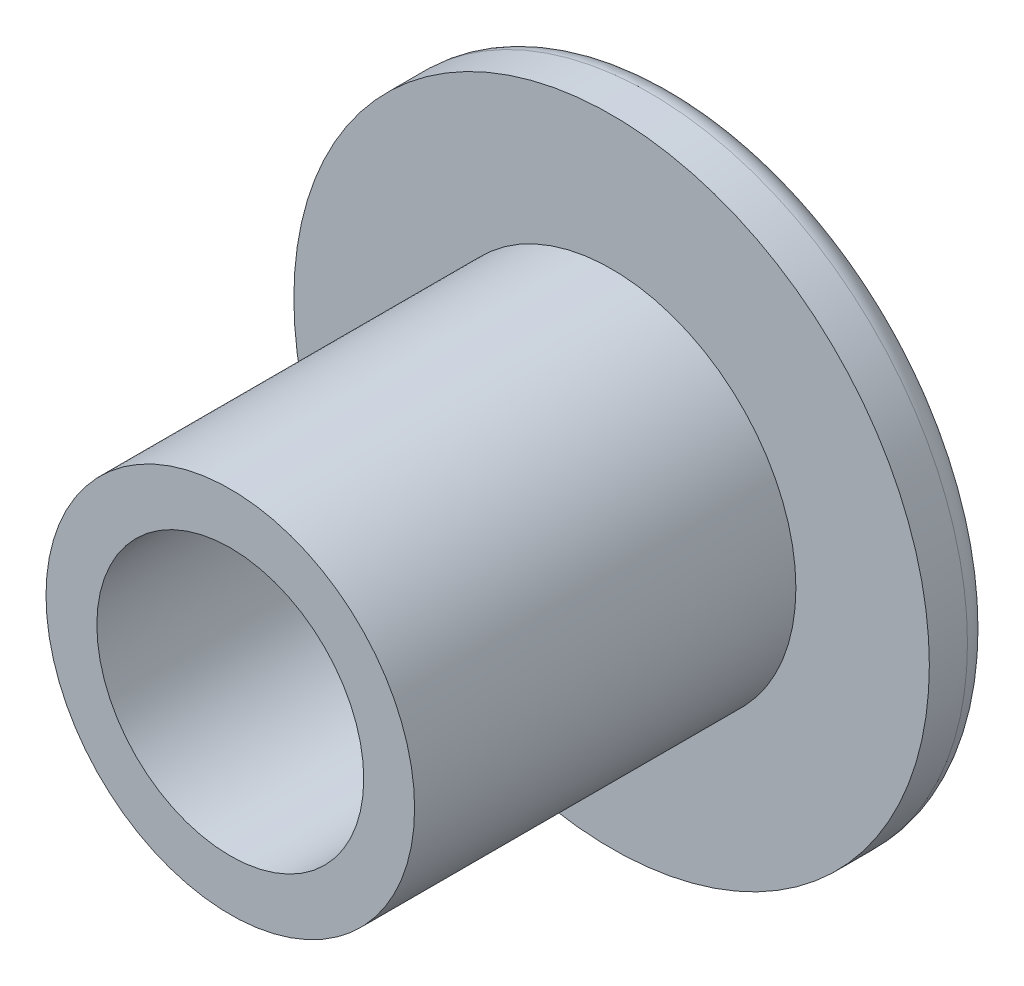
ISO-10303-21;
HEADER;
FILE_DESCRIPTION(('STEP AP214'),'2;1');
FILE_NAME('part.step','',(''),(''),'','','');
FILE_SCHEMA(('AUTOMOTIVE_DESIGN { 1 0 10303 214 1 1 1 1 }'));
ENDSEC;
DATA;
#1=APPLICATION_CONTEXT('core data for automotive mechanical design processes');
#2=APPLICATION_PROTOCOL_DEFINITION('international standard','automotive_design',2000,#1);
#3=PRODUCT_CONTEXT('',#1,'mechanical');
#4=PRODUCT('Part','Part','',(#3));
#5=PRODUCT_RELATED_PRODUCT_CATEGORY('part','',(#4));
#6=PRODUCT_DEFINITION_FORMATION('','',#4);
#7=PRODUCT_DEFINITION_CONTEXT('part definition',#1,'design');
#8=PRODUCT_DEFINITION('design','',#6,#7);
#9=PRODUCT_DEFINITION_SHAPE('','',#8);
#10=(LENGTH_UNIT() NAMED_UNIT(*) SI_UNIT(.MILLI.,.METRE.));
#11=(NAMED_UNIT(*) PLANE_ANGLE_UNIT() SI_UNIT($,.RADIAN.));
#12=(NAMED_UNIT(*) SI_UNIT($,.STERADIAN.) SOLID_ANGLE_UNIT());
#13=UNCERTAINTY_MEASURE_WITH_UNIT(LENGTH_MEASURE(1.E-05),#10,'distance_accuracy_value','');
#14=(GEOMETRIC_REPRESENTATION_CONTEXT(3) GLOBAL_UNCERTAINTY_ASSIGNED_CONTEXT((#13)) GLOBAL_UNIT_ASSIGNED_CONTEXT((#10,
#11,#12)) REPRESENTATION_CONTEXT('',''));
#15=CARTESIAN_POINT('',(0.,0.,0.));
#16=DIRECTION('',(0.,0.,1.));
#17=DIRECTION('',(1.,0.,0.));
#18=AXIS2_PLACEMENT_3D('',#15,#16,#17);
#19=CARTESIAN_POINT('',(0.,0.,1.));
#20=DIRECTION('',(0.,0.,-1.));
#21=DIRECTION('',(-1.,0.,0.));
#22=AXIS2_PLACEMENT_3D('',#19,#20,#21);
#23=CYLINDRICAL_SURFACE('',#22,5.);
#24=CARTESIAN_POINT('',(0.,0.,0.4));
#25=DIRECTION('',(0.,0.,1.));
#26=DIRECTION('',(1.,0.,0.));
#27=AXIS2_PLACEMENT_3D('',#24,#25,#26);
#28=CIRCLE('',#27,5.);
#29=CARTESIAN_POINT('',(5.,0.,0.4));
#30=VERTEX_POINT('',#29);
#31=EDGE_CURVE('E47',#30,#30,#28,.T.);
#32=ORIENTED_EDGE('',*,*,#31,.T.);
#33=EDGE_LOOP('',(#32));
#34=FACE_BOUND('',#33,.T.);
#35=CARTESIAN_POINT('',(0.,0.,1.));
#36=DIRECTION('',(0.,0.,1.));
#37=DIRECTION('',(1.,0.,0.));
#38=AXIS2_PLACEMENT_3D('',#35,#36,#37);
#39=CIRCLE('',#38,5.);
#40=CARTESIAN_POINT('',(5.,0.,1.));
#41=VERTEX_POINT('',#40);
#42=EDGE_CURVE('E52',#41,#41,#39,.T.);
#43=ORIENTED_EDGE('',*,*,#42,.F.);
#44=EDGE_LOOP('',(#43));
#45=FACE_BOUND('',#44,.T.);
#46=ADVANCED_FACE('F32',(#34,#45),#23,.T.);
#47=CARTESIAN_POINT('',(0.,0.,1.));
#48=DIRECTION('',(0.,0.,1.));
#49=DIRECTION('',(1.,0.,0.));
#50=AXIS2_PLACEMENT_3D('',#47,#48,#49);
#51=PLANE('',#50);
#52=CARTESIAN_POINT('',(0.,0.,1.));
#53=DIRECTION('',(0.,0.,1.));
#54=DIRECTION('',(1.,0.,0.));
#55=AXIS2_PLACEMENT_3D('',#52,#53,#54);
#56=CIRCLE('',#55,2.9);
#57=CARTESIAN_POINT('',(2.9,0.,1.));
#58=VERTEX_POINT('',#57);
#59=EDGE_CURVE('E56',#58,#58,#56,.T.);
#60=ORIENTED_EDGE('',*,*,#59,.F.);
#61=EDGE_LOOP('',(#60));
#62=FACE_BOUND('',#61,.T.);
#63=ORIENTED_EDGE('',*,*,#42,.T.);
#64=EDGE_LOOP('',(#63));
#65=FACE_BOUND('',#64,.T.);
#66=ADVANCED_FACE('F74',(#62,#65),#51,.T.);
#67=CARTESIAN_POINT('',(0.,0.,0.));
#68=DIRECTION('',(0.,0.,1.));
#69=DIRECTION('',(1.,0.,0.));
#70=AXIS2_PLACEMENT_3D('',#67,#68,#69);
#71=PLANE('',#70);
#72=CARTESIAN_POINT('',(0.,0.,0.));
#73=DIRECTION('',(0.,0.,1.));
#74=DIRECTION('',(1.,0.,0.));
#75=AXIS2_PLACEMENT_3D('',#72,#73,#74);
#76=CIRCLE('',#75,2.3);
#77=CARTESIAN_POINT('',(2.3,0.,0.));
#78=VERTEX_POINT('',#77);
#79=EDGE_CURVE('E39',#78,#78,#76,.T.);
#80=ORIENTED_EDGE('',*,*,#79,.T.);
#81=EDGE_LOOP('',(#80));
#82=FACE_BOUND('',#81,.T.);
#83=CARTESIAN_POINT('',(0.,0.,0.));
#84=DIRECTION('',(0.,0.,1.));
#85=DIRECTION('',(1.,0.,0.));
#86=AXIS2_PLACEMENT_3D('',#83,#84,#85);
#87=CIRCLE('',#86,4.6);
#88=CARTESIAN_POINT('',(4.6,0.,0.));
#89=VERTEX_POINT('',#88);
#90=EDGE_CURVE('E43',#89,#89,#87,.F.);
#91=ORIENTED_EDGE('',*,*,#90,.T.);
#92=EDGE_LOOP('',(#91));
#93=FACE_BOUND('',#92,.T.);
#94=ADVANCED_FACE('F70',(#82,#93),#71,.F.);
#95=CARTESIAN_POINT('',(0.,0.,7.));
#96=DIRECTION('',(0.,0.,-1.));
#97=DIRECTION('',(-1.,0.,0.));
#98=AXIS2_PLACEMENT_3D('',#95,#96,#97);
#99=CYLINDRICAL_SURFACE('',#98,2.9);
#100=CARTESIAN_POINT('',(0.,0.,7.));
#101=DIRECTION('',(0.,0.,1.));
#102=DIRECTION('',(1.,0.,0.));
#103=AXIS2_PLACEMENT_3D('',#100,#101,#102);
#104=CIRCLE('',#103,2.9);
#105=CARTESIAN_POINT('',(2.9,0.,7.));
#106=VERTEX_POINT('',#105);
#107=EDGE_CURVE('E59',#106,#106,#104,.T.);
#108=ORIENTED_EDGE('',*,*,#107,.F.);
#109=EDGE_LOOP('',(#108));
#110=FACE_BOUND('',#109,.T.);
#111=ORIENTED_EDGE('',*,*,#59,.T.);
#112=EDGE_LOOP('',(#111));
#113=FACE_BOUND('',#112,.T.);
#114=ADVANCED_FACE('F67',(#110,#113),#99,.T.);
#115=CARTESIAN_POINT('',(0.,0.,7.));
#116=DIRECTION('',(0.,0.,1.));
#117=DIRECTION('',(1.,0.,0.));
#118=AXIS2_PLACEMENT_3D('',#115,#116,#117);
#119=PLANE('',#118);
#120=CARTESIAN_POINT('',(0.,0.,7.));
#121=DIRECTION('',(0.,0.,1.));
#122=DIRECTION('',(1.,0.,0.));
#123=AXIS2_PLACEMENT_3D('',#120,#121,#122);
#124=CIRCLE('',#123,2.1);
#125=CARTESIAN_POINT('',(2.1,0.,7.));
#126=VERTEX_POINT('',#125);
#127=EDGE_CURVE('E53',#126,#126,#124,.T.);
#128=ORIENTED_EDGE('',*,*,#127,.F.);
#129=EDGE_LOOP('',(#128));
#130=FACE_BOUND('',#129,.T.);
#131=ORIENTED_EDGE('',*,*,#107,.T.);
#132=EDGE_LOOP('',(#131));
#133=FACE_BOUND('',#132,.T.);
#134=ADVANCED_FACE('F65',(#130,#133),#119,.T.);
#135=CARTESIAN_POINT('',(0.,0.,0.));
#136=DIRECTION('',(0.,0.,1.));
#137=DIRECTION('',(1.,0.,0.));
#138=AXIS2_PLACEMENT_3D('',#135,#136,#137);
#139=CYLINDRICAL_SURFACE('',#138,2.1);
#140=CARTESIAN_POINT('',(0.,0.,0.2));
#141=DIRECTION('',(0.,0.,1.));
#142=DIRECTION('',(1.,0.,0.));
#143=AXIS2_PLACEMENT_3D('',#140,#141,#142);
#144=CIRCLE('',#143,2.1);
#145=CARTESIAN_POINT('',(2.1,0.,0.2));
#146=VERTEX_POINT('',#145);
#147=EDGE_CURVE('E10',#146,#146,#144,.F.);
#148=ORIENTED_EDGE('',*,*,#147,.T.);
#149=EDGE_LOOP('',(#148));
#150=FACE_BOUND('',#149,.T.);
#151=ORIENTED_EDGE('',*,*,#127,.T.);
#152=EDGE_LOOP('',(#151));
#153=FACE_BOUND('',#152,.T.);
#154=ADVANCED_FACE('F88',(#150,#153),#139,.F.);
#155=CARTESIAN_POINT('',(0.,0.,0.4));
#156=DIRECTION('',(0.,0.,1.));
#157=DIRECTION('',(1.,0.,0.));
#158=AXIS2_PLACEMENT_3D('',#155,#156,#157);
#159=TOROIDAL_SURFACE('',#158,4.6,0.4);
#160=ORIENTED_EDGE('',*,*,#90,.F.);
#161=EDGE_LOOP('',(#160));
#162=FACE_BOUND('',#161,.T.);
#163=ORIENTED_EDGE('',*,*,#31,.F.);
#164=EDGE_LOOP('',(#163));
#165=FACE_BOUND('',#164,.T.);
#166=ADVANCED_FACE('F86',(#162,#165),#159,.T.);
#167=CARTESIAN_POINT('',(0.,0.,0.2));
#168=DIRECTION('',(0.,0.,1.));
#169=DIRECTION('',(1.,0.,0.));
#170=AXIS2_PLACEMENT_3D('',#167,#168,#169);
#171=TOROIDAL_SURFACE('',#170,2.3,0.2);
#172=ORIENTED_EDGE('',*,*,#147,.F.);
#173=EDGE_LOOP('',(#172));
#174=FACE_BOUND('',#173,.T.);
#175=ORIENTED_EDGE('',*,*,#79,.F.);
#176=EDGE_LOOP('',(#175));
#177=FACE_BOUND('',#176,.T.);
#178=ADVANCED_FACE('F34',(#174,#177),#171,.T.);
#179=CLOSED_SHELL('',(#46,#66,#94,#114,#134,#154,#166,#178));
#180=MANIFOLD_SOLID_BREP('B2',#179);
#181=ADVANCED_BREP_SHAPE_REPRESENTATION('',(#18,#180),#14);
#182=SHAPE_DEFINITION_REPRESENTATION(#9,#181);
ENDSEC;
END-ISO-10303-21;
